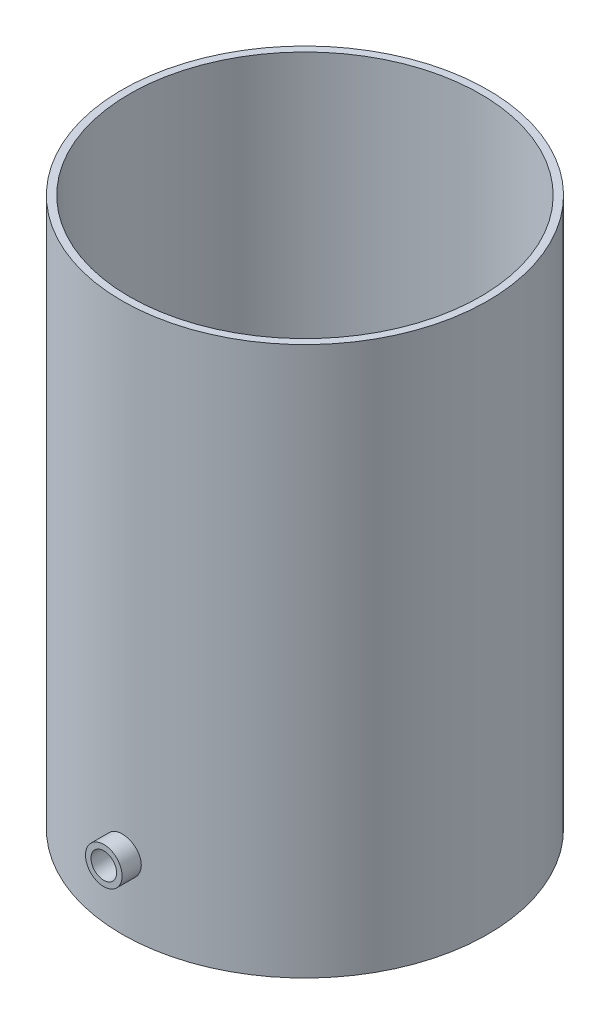
ISO-10303-21;
HEADER;
FILE_DESCRIPTION(('STEP AP214'),'2;1');
FILE_NAME('part.step','',(''),(''),'','','');
FILE_SCHEMA(('AUTOMOTIVE_DESIGN { 1 0 10303 214 1 1 1 1 }'));
ENDSEC;
DATA;
#1=APPLICATION_CONTEXT('core data for automotive mechanical design processes');
#2=APPLICATION_PROTOCOL_DEFINITION('international standard','automotive_design',2000,#1);
#3=PRODUCT_CONTEXT('',#1,'mechanical');
#4=PRODUCT('Part','Part','',(#3));
#5=PRODUCT_RELATED_PRODUCT_CATEGORY('part','',(#4));
#6=PRODUCT_DEFINITION_FORMATION('','',#4);
#7=PRODUCT_DEFINITION_CONTEXT('part definition',#1,'design');
#8=PRODUCT_DEFINITION('design','',#6,#7);
#9=PRODUCT_DEFINITION_SHAPE('','',#8);
#10=(LENGTH_UNIT() NAMED_UNIT(*) SI_UNIT(.MILLI.,.METRE.));
#11=(NAMED_UNIT(*) PLANE_ANGLE_UNIT() SI_UNIT($,.RADIAN.));
#12=(NAMED_UNIT(*) SI_UNIT($,.STERADIAN.) SOLID_ANGLE_UNIT());
#13=UNCERTAINTY_MEASURE_WITH_UNIT(LENGTH_MEASURE(1.E-05),#10,'distance_accuracy_value','');
#14=(GEOMETRIC_REPRESENTATION_CONTEXT(3) GLOBAL_UNCERTAINTY_ASSIGNED_CONTEXT((#13)) GLOBAL_UNIT_ASSIGNED_CONTEXT((#10,
#11,#12)) REPRESENTATION_CONTEXT('',''));
#15=CARTESIAN_POINT('',(0.,0.,0.));
#16=DIRECTION('',(0.,0.,1.));
#17=DIRECTION('',(1.,0.,0.));
#18=AXIS2_PLACEMENT_3D('',#15,#16,#17);
#19=CARTESIAN_POINT('',(0.,150.,0.));
#20=DIRECTION('',(0.,-1.,0.));
#21=DIRECTION('',(0.,0.,-1.));
#22=AXIS2_PLACEMENT_3D('',#19,#20,#21);
#23=CYLINDRICAL_SURFACE('',#22,50.);
#24=CARTESIAN_POINT('',(5.,18.7905589372738,49.749371855331));
#25=CARTESIAN_POINT('',(5.00000137801268,18.9306574283152,49.7493714739879));
#26=CARTESIAN_POINT('',(4.99410950132877,19.0707348898251,49.7499648645192));
#27=CARTESIAN_POINT('',(4.97058574667104,19.34993561116,49.7523207806819));
#28=CARTESIAN_POINT('',(4.95295105278473,19.4890586340254,49.7540835867374));
#29=CARTESIAN_POINT('',(4.90604778501381,19.7654217035784,49.758730371628));
#30=CARTESIAN_POINT('',(4.87676993272645,19.9026601580055,49.7616152445949));
#31=CARTESIAN_POINT('',(4.80678208564671,20.1742181837188,49.7684245439498));
#32=CARTESIAN_POINT('',(4.76606790661486,20.3085366672521,49.7723493507912));
#33=CARTESIAN_POINT('',(4.67355297319563,20.5731202031947,49.7811214960436));
#34=CARTESIAN_POINT('',(4.62176310368343,20.7033890924935,49.7859679281928));
#35=CARTESIAN_POINT('',(4.50742487178653,20.9591411492593,49.7964498317184));
#36=CARTESIAN_POINT('',(4.44487254796571,21.084622533693,49.802085593488));
#37=CARTESIAN_POINT('',(4.30950824036611,21.3297982507876,49.8139814691518));
#38=CARTESIAN_POINT('',(4.23670214819133,21.4494958540135,49.820241223913));
#39=CARTESIAN_POINT('',(4.08129001384987,21.6823883095224,49.833213339352));
#40=CARTESIAN_POINT('',(3.99868035100199,21.7955807362445,49.8399258668515));
#41=CARTESIAN_POINT('',(3.82401365076816,22.0149398958204,49.8536318919189));
#42=CARTESIAN_POINT('',(3.73193021365889,22.1210855614819,49.8606261396673));
#43=CARTESIAN_POINT('',(3.53912598644838,22.3252884435846,49.8746822607949));
#44=CARTESIAN_POINT('',(3.43840201622495,22.4233426557153,49.8817441582155));
#45=CARTESIAN_POINT('',(3.22908697054911,22.6105995568521,49.8957312091272));
#46=CARTESIAN_POINT('',(3.12049844179171,22.6998050892544,49.9026564059683));
#47=CARTESIAN_POINT('',(2.89614565742539,22.868802615413,49.9161794607368));
#48=CARTESIAN_POINT('',(2.780378768861,22.948591123564,49.9227771969379));
#49=CARTESIAN_POINT('',(2.54231086820845,23.0982798233615,49.9354672050881));
#50=CARTESIAN_POINT('',(2.41999887482734,23.1681626300796,49.9415585807929));
#51=CARTESIAN_POINT('',(2.16984658788752,23.2973977499771,49.95305247823));
#52=CARTESIAN_POINT('',(2.04200426340686,23.3567461530346,49.9584547439725));
#53=CARTESIAN_POINT('',(1.78177823539071,23.4644305640457,49.9684119508101));
#54=CARTESIAN_POINT('',(1.64939631724147,23.512770845528,49.9729672205962));
#55=CARTESIAN_POINT('',(1.38098814479936,23.5981303443976,49.9811060833905));
#56=CARTESIAN_POINT('',(1.2449605686204,23.6351453932555,49.9846893185627));
#57=CARTESIAN_POINT('',(0.833882388769763,23.7284955790674,49.9937912974821));
#58=CARTESIAN_POINT('',(0.554665092858854,23.7676189270357,49.9977085084183));
#59=CARTESIAN_POINT('',(-0.00624616004479828,23.7984494565628,50.0007876636083));
#60=CARTESIAN_POINT('',(-0.287940052633875,23.7901578675224,49.9999497311561));
#61=CARTESIAN_POINT('',(-0.844932903547254,23.726582796055,49.9936330634674));
#62=CARTESIAN_POINT('',(-1.12025111715595,23.6714673470847,49.9881709230417));
#63=CARTESIAN_POINT('',(-1.657698930081,23.5160543049235,49.9732365977921));
#64=CARTESIAN_POINT('',(-1.91982835803123,23.4157561248272,49.9637643608788));
#65=CARTESIAN_POINT('',(-2.42400075872671,23.1726448490335,49.9418468380512));
#66=CARTESIAN_POINT('',(-2.66600763658342,23.0297573767378,49.9293963586015));
#67=CARTESIAN_POINT('',(-3.1226677842022,22.7055763934794,49.9029192356571));
#68=CARTESIAN_POINT('',(-3.33732025142287,22.5242817561178,49.8888925459413));
#69=CARTESIAN_POINT('',(-3.73416380023819,22.1274877700501,49.8607646707804));
#70=CARTESIAN_POINT('',(-3.91620871518172,21.9118422082987,49.8466634279516));
#71=CARTESIAN_POINT('',(-4.24153769255961,21.4529746164872,49.8200369971109));
#72=CARTESIAN_POINT('',(-4.38482169876916,21.2097525464268,49.8075118113852));
#73=CARTESIAN_POINT('',(-4.62856091866056,20.7025238098609,49.7854544755204));
#74=CARTESIAN_POINT('',(-4.72900710181732,20.4385127747726,49.7759229565795));
#75=CARTESIAN_POINT('',(-4.88410367923539,19.8972559145872,49.7609450935951));
#76=CARTESIAN_POINT('',(-4.93875546869956,19.62001049297,49.7554986250941));
#77=CARTESIAN_POINT('',(-5.00052387697534,19.0614380394935,49.7493290263652));
#78=CARTESIAN_POINT('',(-5.00784498433649,18.780133835803,49.7485855774055));
#79=CARTESIAN_POINT('',(-4.97528123325639,18.2203026083062,49.7518525677133));
#80=CARTESIAN_POINT('',(-4.93539701266267,17.9417755470258,49.7558629427463));
#81=CARTESIAN_POINT('',(-4.80972587691448,17.3960010254293,49.7681672212266));
#82=CARTESIAN_POINT('',(-4.72403565233786,17.1287310801372,49.7764521004679));
#83=CARTESIAN_POINT('',(-4.50928358198601,16.6123586802857,49.7963645515391));
#84=CARTESIAN_POINT('',(-4.3802207427195,16.3632566420388,49.8079921999376));
#85=CARTESIAN_POINT('',(-4.081875068523,15.8893590609079,49.8333292192867));
#86=CARTESIAN_POINT('',(-3.91245672874386,15.6646492041868,49.8470455463444));
#87=CARTESIAN_POINT('',(-3.53840243770979,15.2467836941598,49.8749916256484));
#88=CARTESIAN_POINT('',(-3.33376561445492,15.0536288223776,49.8892213906003));
#89=CARTESIAN_POINT('',(-2.89419988100485,14.7036506831665,49.9166524134836));
#90=CARTESIAN_POINT('',(-2.65916449432984,14.5469608136719,49.9298497813476));
#91=CARTESIAN_POINT('',(-2.16598537264713,14.2752799204082,49.9536720267587));
#92=CARTESIAN_POINT('',(-1.90784195433101,14.1602883252806,49.9642969395534));
#93=CARTESIAN_POINT('',(-1.37629260849047,13.9754888856322,49.9817608134462));
#94=CARTESIAN_POINT('',(-1.10291484771759,13.9056004760355,49.9886065219256));
#95=CARTESIAN_POINT('',(-0.548079411705791,13.8127481138597,49.99776363907));
#96=CARTESIAN_POINT('',(-0.266621963774155,13.7897828424929,50.0000751751691));
#97=CARTESIAN_POINT('',(0.154560631877543,13.790977101136,49.9999593967711));
#98=CARTESIAN_POINT('',(0.294557002326109,13.7972758755691,49.9993276094659));
#99=CARTESIAN_POINT('',(0.573504458936776,13.8215897774373,49.9969046663024));
#100=CARTESIAN_POINT('',(0.712455913740135,13.8396005558685,49.9951139407924));
#101=CARTESIAN_POINT('',(0.988379892074268,13.8872209169918,49.9904208009026));
#102=CARTESIAN_POINT('',(1.1253516718031,13.9168347474433,49.9875179794045));
#103=CARTESIAN_POINT('',(1.39625643078088,13.9874296828221,49.9806844280751));
#104=CARTESIAN_POINT('',(1.53019050208045,14.0284066303445,49.9767540742154));
#105=CARTESIAN_POINT('',(1.79415256649365,14.1214471102744,49.967974366883));
#106=CARTESIAN_POINT('',(1.92417967668243,14.17351312749,49.963124807464));
#107=CARTESIAN_POINT('',(2.17933687671623,14.2883310973234,49.952645478799));
#108=CARTESIAN_POINT('',(2.30446873549389,14.3510791452218,49.9470159947868));
#109=CARTESIAN_POINT('',(2.5490538144201,14.4868517325829,49.9351311532279));
#110=CARTESIAN_POINT('',(2.6685050084729,14.5598799023736,49.9288755748083));
#111=CARTESIAN_POINT('',(2.90080624471961,14.7156511676476,49.9159178406001));
#112=CARTESIAN_POINT('',(3.01365866446037,14.7983907313851,49.9092158475405));
#113=CARTESIAN_POINT('',(3.23252356376648,14.9734244868848,49.89551955036));
#114=CARTESIAN_POINT('',(3.33850247977287,15.0657605572917,49.8885240518713));
#115=CARTESIAN_POINT('',(3.54227369236162,15.2589863736297,49.8744696846306));
#116=CARTESIAN_POINT('',(3.64006896222842,15.3598729859253,49.8674108399346));
#117=CARTESIAN_POINT('',(3.82688647618723,15.5695852094264,49.8534223720552));
#118=CARTESIAN_POINT('',(3.91590334417577,15.6784156154813,49.84649283014));
#119=CARTESIAN_POINT('',(4.0844367545897,15.9031557506482,49.8329662289084));
#120=CARTESIAN_POINT('',(4.16395679237156,16.0190628512624,49.826369047785));
#121=CARTESIAN_POINT('',(4.31318841414872,16.2575277763916,49.8136731501774));
#122=CARTESIAN_POINT('',(4.38287067354808,16.3801040361758,49.807575945768));
#123=CARTESIAN_POINT('',(4.51162543706042,16.6306813624518,49.7960782991411));
#124=CARTESIAN_POINT('',(4.57070182657144,16.7586804210058,49.7906776019673));
#125=CARTESIAN_POINT('',(4.67780484539498,17.0191330539231,49.7807295606041));
#126=CARTESIAN_POINT('',(4.72584052841938,17.1515828756189,49.7761815177806));
#127=CARTESIAN_POINT('',(4.81056224313698,17.4200463086722,49.7680650371174));
#128=CARTESIAN_POINT('',(4.84725106324241,17.5560590355448,49.7644963586299));
#129=CARTESIAN_POINT('',(4.91858203515326,17.8732247369487,49.7575042744209));
#130=CARTESIAN_POINT('',(4.94908441090261,18.055332692019,49.7544669050514));
#131=CARTESIAN_POINT('',(4.98979244409666,18.4218255541162,49.7504009506177));
#132=CARTESIAN_POINT('',(4.99999818674314,18.6062104515817,49.749372357121));
#133=CARTESIAN_POINT('',(5.,18.7905589372738,49.749371855331));
#134=B_SPLINE_CURVE_WITH_KNOTS('',3,(#24,#25,#26,#27,#28,#29,#30,#31,#32,#33,#34,#35,#36,#37,
#38,#39,#40,#41,#42,#43,#44,#45,#46,#47,#48,#49,#50,#51,#52,#53,#54,#55,#56,#57,#58,#59,#60,#61,
#62,#63,#64,#65,#66,#67,#68,#69,#70,#71,#72,#73,#74,#75,#76,#77,#78,#79,#80,#81,#82,#83,#84,#85,
#86,#87,#88,#89,#90,#91,#92,#93,#94,#95,#96,#97,#98,#99,#100,#101,#102,#103,#104,#105,#106,#107,
#108,#109,#110,#111,#112,#113,#114,#115,#116,#117,#118,#119,#120,#121,#122,#123,#124,#125,#126,
#127,#128,#129,#130,#131,#132,#133),.UNSPECIFIED.,.T.,.F.,(4,2,2,2,2,2,2,2,2,2,2,2,2,2,2,2,2,2,
2,2,2,2,2,2,2,2,2,2,2,2,2,2,2,2,2,2,2,2,2,2,2,2,2,2,2,2,2,2,2,2,2,2,2,2,4),(0.,
0.420134252377986,0.840369288708549,1.26093988247998,1.68166455241807,2.10197763072134,
2.52244574981761,2.9426732548295,3.36305644524304,3.78464455225725,4.20638849474177,
4.62799647384532,5.04976002021869,5.47225484994391,5.8949061733306,6.31739313593607,
6.74003541866831,7.58156484320105,8.42307244819019,9.26157288921165,10.1000842223273,
10.9400685715992,11.780077559205,12.6237625525286,13.4674487696567,14.3113127541753,
15.1551510280302,15.9953411136668,16.8355198466221,17.6739320335049,18.5123634263309,
19.3536507888645,20.1949589844387,21.0392981391845,21.8836257241788,22.7264409329966,
23.569232453936,23.9892420866313,24.4090958466629,24.8291034547195,25.2489575975693,
25.6689059193386,26.0887010611433,26.5086448232866,26.9284363348062,27.3501435264971,
27.7716968321212,28.1935067243476,28.6151608857008,29.0380465190118,29.4607769131124,
29.8831594088447,30.3054380244043,30.8582736600066,31.411106974895),.UNSPECIFIED.);
#135=CARTESIAN_POINT('',(5.,18.7905589372738,49.749371855331));
#136=VERTEX_POINT('',#135);
#137=EDGE_CURVE('E65',#136,#136,#134,.T.);
#138=ORIENTED_EDGE('',*,*,#137,.F.);
#139=EDGE_LOOP('',(#138));
#140=FACE_BOUND('',#139,.T.);
#141=CARTESIAN_POINT('',(0.,150.,0.));
#142=DIRECTION('',(0.,1.,0.));
#143=DIRECTION('',(0.,0.,1.));
#144=AXIS2_PLACEMENT_3D('',#141,#142,#143);
#145=CIRCLE('',#144,50.);
#146=CARTESIAN_POINT('',(0.,150.,50.));
#147=VERTEX_POINT('',#146);
#148=EDGE_CURVE('E51',#147,#147,#145,.T.);
#149=ORIENTED_EDGE('',*,*,#148,.F.);
#150=EDGE_LOOP('',(#149));
#151=FACE_BOUND('',#150,.T.);
#152=CARTESIAN_POINT('',(0.,0.,0.));
#153=DIRECTION('',(0.,1.,0.));
#154=DIRECTION('',(0.,0.,1.));
#155=AXIS2_PLACEMENT_3D('',#152,#153,#154);
#156=CIRCLE('',#155,50.);
#157=CARTESIAN_POINT('',(0.,0.,50.));
#158=VERTEX_POINT('',#157);
#159=EDGE_CURVE('E55',#158,#158,#156,.T.);
#160=ORIENTED_EDGE('',*,*,#159,.T.);
#161=EDGE_LOOP('',(#160));
#162=FACE_BOUND('',#161,.T.);
#163=CARTESIAN_POINT('',(0.,23.7905589372738,-50.));
#164=CARTESIAN_POINT('',(0.140100461033939,23.7905603150286,-50.0000003743881));
#165=CARTESIAN_POINT('',(0.280179892133935,23.7846682742154,-49.9994099664565));
#166=CARTESIAN_POINT('',(0.559384605481638,23.761143848146,-49.9970656286844));
#167=CARTESIAN_POINT('',(0.698509650807411,23.7435086471826,-49.9953114197949));
#168=CARTESIAN_POINT('',(0.974876810291471,23.6966039919592,-49.990686488879));
#169=CARTESIAN_POINT('',(1.11211733275273,23.667325261914,-49.9878148767159));
#170=CARTESIAN_POINT('',(1.38367953746195,23.5973352487088,-49.9810352616414));
#171=CARTESIAN_POINT('',(1.51800013207783,23.556619781557,-49.9771268794695));
#172=CARTESIAN_POINT('',(1.78258815793808,23.4641017370919,-49.968388862618));
#173=CARTESIAN_POINT('',(1.9128594168042,23.4123100186544,-49.9635601307267));
#174=CARTESIAN_POINT('',(2.16861600653063,23.2979676404163,-49.9531129442553));
#175=CARTESIAN_POINT('',(2.29409955432331,23.2354130191065,-49.9474941990341));
#176=CARTESIAN_POINT('',(2.53927920710544,23.1000437656533,-49.9356297496778));
#177=CARTESIAN_POINT('',(2.65897858413043,23.027235027599,-49.9293844063018));
#178=CARTESIAN_POINT('',(2.89187409366608,22.8718173593229,-49.9164369111371));
#179=CARTESIAN_POINT('',(3.00506780046608,22.7892048083796,-49.90973459097));
#180=CARTESIAN_POINT('',(3.22442516584175,22.6145352313753,-49.8960438865044));
#181=CARTESIAN_POINT('',(3.33056800916345,22.5224521230995,-49.8890547458808));
#182=CARTESIAN_POINT('',(3.53476522468386,22.3296491506162,-49.8750029081307));
#183=CARTESIAN_POINT('',(3.6328165925971,22.2289261065415,-49.8679401847701));
#184=CARTESIAN_POINT('',(3.82006793418719,22.0196134760238,-49.853945639318));
#185=CARTESIAN_POINT('',(3.90927074723064,21.9110264324949,-49.8470137758174));
#186=CARTESIAN_POINT('',(4.07826305039189,21.6866771710813,-49.8334722976176));
#187=CARTESIAN_POINT('',(4.15804905479459,21.5709123203028,-49.8268628027738));
#188=CARTESIAN_POINT('',(4.30773494085765,21.3328460075943,-49.8141453282559));
#189=CARTESIAN_POINT('',(4.37761719102718,21.2105334090037,-49.8080382509359));
#190=CARTESIAN_POINT('',(4.50685113325593,20.960379951196,-49.796510955401));
#191=CARTESIAN_POINT('',(4.56619891513861,20.8325370610557,-49.7910909924413));
#192=CARTESIAN_POINT('',(4.67388203969832,20.5723098781158,-49.7810984182545));
#193=CARTESIAN_POINT('',(4.72222165895323,20.4399273719948,-49.7765254780955));
#194=CARTESIAN_POINT('',(4.80757979958036,20.1715179084228,-49.7683532658288));
#195=CARTESIAN_POINT('',(4.84459415265808,20.0354896291207,-49.7647543522704));
#196=CARTESIAN_POINT('',(4.93794230581998,19.6244084103272,-49.7556112743006));
#197=CARTESIAN_POINT('',(4.97706409180383,19.3451885112565,-49.7516744142284));
#198=CARTESIAN_POINT('',(5.00789059851941,18.7842721631673,-49.7485802587524));
#199=CARTESIAN_POINT('',(4.9995965655709,18.5025757794373,-49.7494228377215));
#200=CARTESIAN_POINT('',(4.93601762379309,17.9455937048532,-49.7557708498252));
#201=CARTESIAN_POINT('',(4.88090320838524,17.6702884729576,-49.7612593648233));
#202=CARTESIAN_POINT('',(4.72549673300413,17.1328660889001,-49.7762565790783));
#203=CARTESIAN_POINT('',(4.62520406273851,16.8707491149455,-49.7857653326426));
#204=CARTESIAN_POINT('',(4.38210419746261,16.3665918154359,-49.8077505089504));
#205=CARTESIAN_POINT('',(4.23922134072076,16.1245882081484,-49.8202322051485));
#206=CARTESIAN_POINT('',(3.91505020964741,15.6679326443869,-49.846752576903));
#207=CARTESIAN_POINT('',(3.73376081125102,15.4532814887464,-49.8607912980239));
#208=CARTESIAN_POINT('',(3.33697054240559,15.0564320262057,-49.8889192682764));
#209=CARTESIAN_POINT('',(3.12132238898974,14.8743809436402,-49.9030084673536));
#210=CARTESIAN_POINT('',(2.66244741395265,14.5490407569514,-49.9295914532222));
#211=CARTESIAN_POINT('',(2.41922056141157,14.4057516962867,-49.9420852382248));
#212=CARTESIAN_POINT('',(1.91199052704802,14.1620088399281,-49.9640737835429));
#213=CARTESIAN_POINT('',(1.64798373156272,14.061562514231,-49.9735680207869));
#214=CARTESIAN_POINT('',(1.10673608703645,13.9064643526677,-49.988482372022));
#215=CARTESIAN_POINT('',(0.829495634016399,13.8518111473363,-49.9939026078476));
#216=CARTESIAN_POINT('',(0.270925495326698,13.7900373985845,-50.0000425834211));
#217=CARTESIAN_POINT('',(-0.0103815106741372,13.7827136949108,-50.000782413361));
#218=CARTESIAN_POINT('',(-0.570218966431819,13.8152732536181,-49.9975320878656));
#219=CARTESIAN_POINT('',(-0.848749453648461,13.8551558782366,-49.993541996332));
#220=CARTESIAN_POINT('',(-1.39454103462632,13.9808274100044,-49.9812930768513));
#221=CARTESIAN_POINT('',(-1.66182424652395,14.0665211932687,-49.9730430954945));
#222=CARTESIAN_POINT('',(-2.17822160525502,14.2812848238558,-49.953199943438));
#223=CARTESIAN_POINT('',(-2.42733534458293,14.4103556436763,-49.9416066977843));
#224=CARTESIAN_POINT('',(-2.90124090708419,14.7087130691826,-49.9163237649944));
#225=CARTESIAN_POINT('',(-3.12594832200516,14.8781331523532,-49.9026271744651));
#226=CARTESIAN_POINT('',(-3.54380809329823,15.2521895055339,-49.8746966491831));
#227=CARTESIAN_POINT('',(-3.73695965742386,15.4568266594448,-49.8604627009505));
#228=CARTESIAN_POINT('',(-4.08693063657039,15.8963909506641,-49.8330011856591));
#229=CARTESIAN_POINT('',(-4.24361671913491,16.1314245053869,-49.8197774270285));
#230=CARTESIAN_POINT('',(-4.51529096798641,16.6245989525634,-49.7958917029636));
#231=CARTESIAN_POINT('',(-4.63027970447968,16.8827395289711,-49.7852297024982));
#232=CARTESIAN_POINT('',(-4.81507725706781,17.414290657509,-49.7676970839323));
#233=CARTESIAN_POINT('',(-4.88496539977527,17.6876734748294,-49.7608198120965));
#234=CARTESIAN_POINT('',(-4.97781551006116,18.2425195886968,-49.7516193745049));
#235=CARTESIAN_POINT('',(-5.0007788234884,18.5239826532598,-49.7492960781367));
#236=CARTESIAN_POINT('',(-4.99958027457784,18.9451662222175,-49.7494127947303));
#237=CARTESIAN_POINT('',(-4.99328044671944,19.0851581884164,-49.7500479099195));
#238=CARTESIAN_POINT('',(-4.96896519008512,19.3640967133967,-49.7524830219634));
#239=CARTESIAN_POINT('',(-4.9509541101499,19.503043640875,-49.754282586412));
#240=CARTESIAN_POINT('',(-4.9033339265936,19.7789585035611,-49.7589979715237));
#241=CARTESIAN_POINT('',(-4.87372057237539,19.915925694384,-49.7619142012784));
#242=CARTESIAN_POINT('',(-4.8031274021827,20.1868212731159,-49.7687776142575));
#243=CARTESIAN_POINT('',(-4.7621517427028,20.3207507529188,-49.7727244204516));
#244=CARTESIAN_POINT('',(-4.66911475363506,20.5847034879644,-49.7815382320036));
#245=CARTESIAN_POINT('',(-4.6170509625864,20.7147258685427,-49.7864054416556));
#246=CARTESIAN_POINT('',(-4.50223825911722,20.9698739535313,-49.7969192874116));
#247=CARTESIAN_POINT('',(-4.43949325070048,21.095001426562,-49.8025656385956));
#248=CARTESIAN_POINT('',(-4.30372744333054,21.3395782947513,-49.8144815572328));
#249=CARTESIAN_POINT('',(-4.23070301224569,21.4590256628571,-49.82075134474));
#250=CARTESIAN_POINT('',(-4.07493978433922,21.6913199622855,-49.8337332394463));
#251=CARTESIAN_POINT('',(-3.99220451871276,21.8041692706648,-49.8404451854741));
#252=CARTESIAN_POINT('',(-3.81717528907235,22.0230343727823,-49.8541564093712));
#253=CARTESIAN_POINT('',(-3.72483897640454,22.1290162287108,-49.8611568702573));
#254=CARTESIAN_POINT('',(-3.53161206753512,22.3327933443092,-49.8752152226331));
#255=CARTESIAN_POINT('',(-3.43072460522393,22.4305915772859,-49.8822730922333));
#256=CARTESIAN_POINT('',(-3.2210100998708,22.6174149009678,-49.8962537831342));
#257=CARTESIAN_POINT('',(-3.11217826461907,22.7064346189029,-49.9031765196754));
#258=CARTESIAN_POINT('',(-2.88743471180054,22.8749735088648,-49.9166844506629));
#259=CARTESIAN_POINT('',(-2.77152562327502,22.9544961767727,-49.9232697688008));
#260=CARTESIAN_POINT('',(-2.5330592655813,23.1037308347114,-49.9359380152465));
#261=CARTESIAN_POINT('',(-2.41048371893775,23.1734137521737,-49.9420194337243));
#262=CARTESIAN_POINT('',(-2.15990777377624,23.3021699076479,-49.9534835762051));
#263=CARTESIAN_POINT('',(-2.03190938317773,23.3612470309634,-49.9588665558713));
#264=CARTESIAN_POINT('',(-1.77145809043289,23.4683515771038,-49.9687792484329));
#265=CARTESIAN_POINT('',(-1.63900893926476,23.5163880496343,-49.9733096595983));
#266=CARTESIAN_POINT('',(-1.37054695395703,23.601111388363,-49.9813929477421));
#267=CARTESIAN_POINT('',(-1.23453500404774,23.6378010422498,-49.9849460647987));
#268=CARTESIAN_POINT('',(-0.917364218647636,23.7091356127423,-49.9919068178199));
#269=CARTESIAN_POINT('',(-0.735250267899013,23.7396400062006,-49.9949297207431));
#270=CARTESIAN_POINT('',(-0.368745400564772,23.7803507201355,-49.9989760613865));
#271=CARTESIAN_POINT('',(-0.184354493372666,23.7905571243227,-49.9999995073526));
#272=CARTESIAN_POINT('',(0.,23.7905589372738,-50.));
#273=B_SPLINE_CURVE_WITH_KNOTS('',3,(#163,#164,#165,#166,#167,#168,#169,#170,#171,#172,#173,
#174,#175,#176,#177,#178,#179,#180,#181,#182,#183,#184,#185,#186,#187,#188,#189,#190,#191,#192,
#193,#194,#195,#196,#197,#198,#199,#200,#201,#202,#203,#204,#205,#206,#207,#208,#209,#210,#211,
#212,#213,#214,#215,#216,#217,#218,#219,#220,#221,#222,#223,#224,#225,#226,#227,#228,#229,#230,
#231,#232,#233,#234,#235,#236,#237,#238,#239,#240,#241,#242,#243,#244,#245,#246,#247,#248,#249,
#250,#251,#252,#253,#254,#255,#256,#257,#258,#259,#260,#261,#262,#263,#264,#265,#266,#267,#268,
#269,#270,#271,#272),.UNSPECIFIED.,.T.,.F.,(4,2,2,2,2,2,2,2,2,2,2,2,2,2,2,2,2,2,2,2,2,2,2,2,2,2,
2,2,2,2,2,2,2,2,2,2,2,2,2,2,2,2,2,2,2,2,2,2,2,2,2,2,2,2,4),(0.,0.420140168309291,
0.840381111696771,1.26095751168313,1.68168797529278,2.10200784094379,2.52248274628059,
2.94271694071896,3.36310682092266,3.78468715311913,4.20642331622124,4.62802370983913,
5.04977967635892,5.47227730157367,5.89493142271309,6.31742106512359,6.74006601944364,
7.58160289957827,8.42311766010726,9.26158116937397,10.1000560054001,10.9400293659632,
11.7800273138747,12.6237280071288,13.467429646307,14.3112783319975,15.1551017810904,
15.9953007277063,16.8354883232756,17.6739380620337,18.5124065997918,19.3536883347534,
20.1949911878299,21.0393234777484,21.8836442210872,22.7264758269686,23.5692832592977,
23.9892798829599,24.4091206346367,24.8291153427782,25.2489566130453,25.6688911814504,
26.0886725912905,26.5086027007735,26.9283805794993,27.3500956078529,27.7716567456625,
28.1934743134009,28.6151361275947,29.0380188241247,29.460746285189,29.883126003011,
30.305401867917,30.8582554897697,31.4111068316036),.UNSPECIFIED.);
#274=CARTESIAN_POINT('',(0.,23.7905589372738,-50.));
#275=VERTEX_POINT('',#274);
#276=EDGE_CURVE('E10',#275,#275,#273,.T.);
#277=ORIENTED_EDGE('',*,*,#276,.F.);
#278=EDGE_LOOP('',(#277));
#279=FACE_BOUND('',#278,.T.);
#280=ADVANCED_FACE('F40',(#140,#151,#162,#279),#23,.T.);
#281=CARTESIAN_POINT('',(0.,150.,0.));
#282=DIRECTION('',(0.,1.,0.));
#283=DIRECTION('',(0.,0.,1.));
#284=AXIS2_PLACEMENT_3D('',#281,#282,#283);
#285=PLANE('',#284);
#286=ORIENTED_EDGE('',*,*,#148,.T.);
#287=EDGE_LOOP('',(#286));
#288=FACE_BOUND('',#287,.T.);
#289=CARTESIAN_POINT('',(0.,150.,0.));
#290=DIRECTION('',(0.,1.,0.));
#291=DIRECTION('',(0.,0.,1.));
#292=AXIS2_PLACEMENT_3D('',#289,#290,#291);
#293=CIRCLE('',#292,48.);
#294=CARTESIAN_POINT('',(0.,150.,48.));
#295=VERTEX_POINT('',#294);
#296=EDGE_CURVE('E60',#295,#295,#293,.T.);
#297=ORIENTED_EDGE('',*,*,#296,.F.);
#298=EDGE_LOOP('',(#297));
#299=FACE_BOUND('',#298,.T.);
#300=ADVANCED_FACE('F99',(#288,#299),#285,.T.);
#301=CARTESIAN_POINT('',(0.,0.,0.));
#302=DIRECTION('',(0.,1.,0.));
#303=DIRECTION('',(0.,0.,1.));
#304=AXIS2_PLACEMENT_3D('',#301,#302,#303);
#305=PLANE('',#304);
#306=ORIENTED_EDGE('',*,*,#159,.F.);
#307=EDGE_LOOP('',(#306));
#308=FACE_BOUND('',#307,.T.);
#309=CARTESIAN_POINT('',(0.,0.,0.));
#310=DIRECTION('',(0.,1.,0.));
#311=DIRECTION('',(0.,0.,1.));
#312=AXIS2_PLACEMENT_3D('',#309,#310,#311);
#313=CIRCLE('',#312,48.);
#314=CARTESIAN_POINT('',(0.,0.,48.));
#315=VERTEX_POINT('',#314);
#316=EDGE_CURVE('E62',#315,#315,#313,.T.);
#317=ORIENTED_EDGE('',*,*,#316,.T.);
#318=EDGE_LOOP('',(#317));
#319=FACE_BOUND('',#318,.T.);
#320=ADVANCED_FACE('F94',(#308,#319),#305,.F.);
#321=CARTESIAN_POINT('',(0.,150.,0.));
#322=DIRECTION('',(0.,-1.,0.));
#323=DIRECTION('',(0.,0.,-1.));
#324=AXIS2_PLACEMENT_3D('',#321,#322,#323);
#325=CYLINDRICAL_SURFACE('',#324,48.);
#326=CARTESIAN_POINT('',(0.,22.2905589372738,-48.));
#327=CARTESIAN_POINT('',(-0.196316737087011,22.290550327557,-47.999998314885));
#328=CARTESIAN_POINT('',(-0.392769163715083,22.2739861529966,-47.9987827555955));
#329=CARTESIAN_POINT('',(-0.780244437071165,22.2081489825878,-47.9940505151423));
#330=CARTESIAN_POINT('',(-0.971260778787283,22.1588383869092,-47.9905311888323));
#331=CARTESIAN_POINT('',(-1.34219554689538,22.0289367254721,-47.9815893453795));
#332=CARTESIAN_POINT('',(-1.52211996353107,21.9483627182354,-47.9761678662787));
#333=CARTESIAN_POINT('',(-1.86584511255985,21.7582504539965,-47.9640306566817));
#334=CARTESIAN_POINT('',(-2.02964941308498,21.648718626585,-47.9573152135779));
#335=CARTESIAN_POINT('',(-2.33685508474223,21.4035635282267,-47.9433294072533));
#336=CARTESIAN_POINT('',(-2.48022009852654,21.2678947481743,-47.9360580896743));
#337=CARTESIAN_POINT('',(-2.74216609151634,20.9744120822291,-47.9217881334207));
#338=CARTESIAN_POINT('',(-2.86074601091128,20.8165972498533,-47.9147895064168));
#339=CARTESIAN_POINT('',(-3.06987409202356,20.4830882574769,-47.9018465506979));
#340=CARTESIAN_POINT('',(-3.16039105971814,20.3073744875795,-47.8959033983313));
#341=CARTESIAN_POINT('',(-3.3106244027704,19.9431925594134,-47.8857543390969));
#342=CARTESIAN_POINT('',(-3.37034120781006,19.7547245791155,-47.8815484079939));
#343=CARTESIAN_POINT('',(-3.45717557739047,19.3707425670913,-47.8753574238119));
#344=CARTESIAN_POINT('',(-3.484351420791,19.1752417796961,-47.8733684008305));
#345=CARTESIAN_POINT('',(-3.50551241756807,18.7824441779782,-47.8718236643034));
#346=CARTESIAN_POINT('',(-3.4994980613978,18.5851473902381,-47.8722679148013));
#347=CARTESIAN_POINT('',(-3.45449764244278,18.1947564747816,-47.8755359440817));
#348=CARTESIAN_POINT('',(-3.41557476801679,18.0016550198407,-47.8783551625992));
#349=CARTESIAN_POINT('',(-3.30596027591858,17.6247335503884,-47.8860482799574));
#350=CARTESIAN_POINT('',(-3.2352684119987,17.4409136078321,-47.8909221947245));
#351=CARTESIAN_POINT('',(-3.06405134485914,17.0875708728856,-47.902180743519));
#352=CARTESIAN_POINT('',(-2.96349762350364,16.9180619471883,-47.9085668204777));
#353=CARTESIAN_POINT('',(-2.73543180160518,16.5983045933085,-47.9221286974105));
#354=CARTESIAN_POINT('',(-2.60791928506839,16.4480564623917,-47.92930450957));
#355=CARTESIAN_POINT('',(-2.32920028684797,16.1707181612884,-47.9436575298958));
#356=CARTESIAN_POINT('',(-2.17793914721246,16.0436829128126,-47.9508347021589));
#357=CARTESIAN_POINT('',(-1.85620782894145,15.8168005410795,-47.9643656479059));
#358=CARTESIAN_POINT('',(-1.68573764106417,15.716953430903,-47.9707194209936));
#359=CARTESIAN_POINT('',(-1.33039282248398,15.5472857027673,-47.9818884488372));
#360=CARTESIAN_POINT('',(-1.14551711659266,15.4774673286113,-47.9867035886167));
#361=CARTESIAN_POINT('',(-0.766624776904359,15.369876464548,-47.9942513627934));
#362=CARTESIAN_POINT('',(-0.572608288400159,15.3321034654606,-47.9969840302797));
#363=CARTESIAN_POINT('',(-0.181418096466174,15.2897440153639,-48.0000546972346));
#364=CARTESIAN_POINT('',(0.0157473470887529,15.2850816639887,-48.0003981734688));
#365=CARTESIAN_POINT('',(0.40805728363101,15.3088773004592,-47.998666351323));
#366=CARTESIAN_POINT('',(0.603201790985797,15.3373350526807,-47.9965910701507));
#367=CARTESIAN_POINT('',(0.985715399178932,15.4265002103004,-47.9902587695949));
#368=CARTESIAN_POINT('',(1.17309269867893,15.4871726261544,-47.9860041174838));
#369=CARTESIAN_POINT('',(1.53500641812635,15.6390092166739,-47.9757914012687));
#370=CARTESIAN_POINT('',(1.70954268152178,15.7301737630102,-47.9698333164016));
#371=CARTESIAN_POINT('',(2.0411664610272,15.9405988547885,-47.956868811667));
#372=CARTESIAN_POINT('',(2.19822185745092,16.0599099025812,-47.9498605157829));
#373=CARTESIAN_POINT('',(2.49010192498372,16.3231679460449,-47.9355899975049));
#374=CARTESIAN_POINT('',(2.62492629989622,16.4671152699071,-47.9283277717294));
#375=CARTESIAN_POINT('',(2.86877577944745,16.7758880835154,-47.9143518532065));
#376=CARTESIAN_POINT('',(2.97775150865499,16.9407526217474,-47.9076392260445));
#377=CARTESIAN_POINT('',(3.16647216861626,17.286484604406,-47.8955366892029));
#378=CARTESIAN_POINT('',(3.24621733195611,17.4673519214851,-47.8901467689989));
#379=CARTESIAN_POINT('',(3.37412832748217,17.8397775214091,-47.8813052576689));
#380=CARTESIAN_POINT('',(3.42232483998624,18.0313252204765,-47.8778517838647));
#381=CARTESIAN_POINT('',(3.48587046987139,18.4198202823303,-47.8732674661299));
#382=CARTESIAN_POINT('',(3.50122005419262,18.6167675683177,-47.8721365891821));
#383=CARTESIAN_POINT('',(3.49863123709268,19.0099804176457,-47.8723258193994));
#384=CARTESIAN_POINT('',(3.48077043520007,19.2062464993243,-47.873640212939));
#385=CARTESIAN_POINT('',(3.4124291691847,19.5929843478622,-47.8785597579695));
#386=CARTESIAN_POINT('',(3.36194864984299,19.7834561049121,-47.8821649133382));
#387=CARTESIAN_POINT('',(3.22981948039715,20.1532069118743,-47.8912582943493));
#388=CARTESIAN_POINT('',(3.14817169272353,20.3324862713322,-47.8967464678862));
#389=CARTESIAN_POINT('',(2.9560351511478,20.6748042210553,-47.9089874882372));
#390=CARTESIAN_POINT('',(2.8455470070334,20.8378431546002,-47.9157403083113));
#391=CARTESIAN_POINT('',(2.59857598389504,21.1434480182489,-47.9297683227365));
#392=CARTESIAN_POINT('',(2.46203615919196,21.2859678760136,-47.9370446392667));
#393=CARTESIAN_POINT('',(2.16693053645851,21.5461182263946,-47.9512897258089));
#394=CARTESIAN_POINT('',(2.00835938583827,21.6637426529994,-47.9582584205392));
#395=CARTESIAN_POINT('',(1.6734544193649,21.870882359556,-47.9711127183892));
#396=CARTESIAN_POINT('',(1.49709391175383,21.9603545448639,-47.9769966553471));
#397=CARTESIAN_POINT('',(1.13193521794283,22.1083056983078,-47.9869976662948));
#398=CARTESIAN_POINT('',(0.943151761496642,22.1668206532994,-47.9911167907621));
#399=CARTESIAN_POINT('',(0.627693448504029,22.2361294499554,-47.9960548028185));
#400=CARTESIAN_POINT('',(0.503053097053779,22.256513774688,-47.9975276027274));
#401=CARTESIAN_POINT('',(0.252293845247635,22.2837312719091,-47.9995007418906));
#402=CARTESIAN_POINT('',(0.126174947776727,22.2905644708345,-48.0000010830421));
#403=CARTESIAN_POINT('',(0.,22.2905589372738,-48.));
#404=B_SPLINE_CURVE_WITH_KNOTS('',3,(#326,#327,#328,#329,#330,#331,#332,#333,#334,#335,#336,
#337,#338,#339,#340,#341,#342,#343,#344,#345,#346,#347,#348,#349,#350,#351,#352,#353,#354,#355,
#356,#357,#358,#359,#360,#361,#362,#363,#364,#365,#366,#367,#368,#369,#370,#371,#372,#373,#374,
#375,#376,#377,#378,#379,#380,#381,#382,#383,#384,#385,#386,#387,#388,#389,#390,#391,#392,#393,
#394,#395,#396,#397,#398,#399,#400,#401,#402,#403),.UNSPECIFIED.,.T.,.F.,(4,2,2,2,2,2,2,2,2,2,2,
2,2,2,2,2,2,2,2,2,2,2,2,2,2,2,2,2,2,2,2,2,2,2,2,2,2,2,4),(0.,0.588489568935996,1.17765601961282,
1.76650144942666,2.35521624578719,2.94496551868975,3.53474000411282,4.12516773577756,
4.71558723037448,5.30494773086247,5.89429952236519,6.48252224998158,7.07074953710581,
7.65954039895944,8.24834034694793,8.83851585070529,9.42869163840682,10.0189115174841,
10.609122018177,11.1979791265768,11.7868320457328,12.3750466942399,12.9632685128018,
13.5525538954911,14.1418471289316,14.7322571101474,15.322662393399,15.9124926650873,
16.5023145519043,17.0907599899853,17.6792064241948,18.2676365766638,18.8560542886339,
19.4457732561711,20.03563574941,20.6263968431766,21.2164696774042,21.5946991986853,
21.972927982076),.UNSPECIFIED.);
#405=CARTESIAN_POINT('',(0.,22.2905589372738,-48.));
#406=VERTEX_POINT('',#405);
#407=EDGE_CURVE('E124',#406,#406,#404,.T.);
#408=ORIENTED_EDGE('',*,*,#407,.F.);
#409=EDGE_LOOP('',(#408));
#410=FACE_BOUND('',#409,.T.);
#411=CARTESIAN_POINT('',(3.5,18.7905589372738,47.8722257681842));
#412=CARTESIAN_POINT('',(3.49999138957606,18.5942429824981,47.8722274700572));
#413=CARTESIAN_POINT('',(3.48342734256522,18.3977913355925,47.8734463491947));
#414=CARTESIAN_POINT('',(3.41759072487511,18.0103176823594,47.8781904509557));
#415=CARTESIAN_POINT('',(3.36828055169529,17.8193021816549,47.8817183249395));
#416=CARTESIAN_POINT('',(3.23838012631429,17.4483691915135,47.8906787146652));
#417=CARTESIAN_POINT('',(3.1578069527656,17.2684457047101,47.8961101903329));
#418=CARTESIAN_POINT('',(2.96769665152349,16.9247221122654,47.908264478146));
#419=CARTESIAN_POINT('',(2.85816595135998,16.7609184396629,47.9149870036342));
#420=CARTESIAN_POINT('',(2.61301198929144,16.4537120532295,47.9289810477293));
#421=CARTESIAN_POINT('',(2.47734296667445,16.3103458970023,47.9362535153588));
#422=CARTESIAN_POINT('',(2.18385933669576,16.0483977007248,47.9505192591928));
#423=CARTESIAN_POINT('',(2.02604378595915,15.9298167169837,47.9575125234878));
#424=CARTESIAN_POINT('',(1.69253416987266,15.7206875273624,47.9704405346613));
#425=CARTESIAN_POINT('',(1.51682061810998,15.6301703187797,47.9763741080349));
#426=CARTESIAN_POINT('',(1.15263916420776,15.4799364701167,47.9865040505491));
#427=CARTESIAN_POINT('',(0.96417143883987,15.4202194032482,47.9907004437612));
#428=CARTESIAN_POINT('',(0.580190184136626,15.3333844799106,47.9968766033038));
#429=CARTESIAN_POINT('',(0.384689903620491,15.3062083239489,47.9988603333489));
#430=CARTESIAN_POINT('',(-0.00810670735441337,15.2850465264531,48.0004010445214));
#431=CARTESIAN_POINT('',(-0.205403011410987,15.2910603977976,47.9999580612651));
#432=CARTESIAN_POINT('',(-0.595796078166492,15.336060054056,47.9966985477487));
#433=CARTESIAN_POINT('',(-0.788900111111866,15.3749831385101,47.9938865311391));
#434=CARTESIAN_POINT('',(-1.16582662830556,15.4845989461887,47.9862105899786));
#435=CARTESIAN_POINT('',(-1.34964904197534,15.5552919109546,47.9813466498273));
#436=CARTESIAN_POINT('',(-1.70299475338241,15.7265112473497,47.9701065228885));
#437=CARTESIAN_POINT('',(-1.87250431009621,15.8270658785939,47.9637289047836));
#438=CARTESIAN_POINT('',(-2.19226253915424,16.0551336370655,47.9501786919807));
#439=CARTESIAN_POINT('',(-2.34251091385207,16.1826471808129,47.9430060850009));
#440=CARTESIAN_POINT('',(-2.61984803638129,16.4613669015974,47.928652886598));
#441=CARTESIAN_POINT('',(-2.74688207042909,16.6126275284162,47.9214723154425));
#442=CARTESIAN_POINT('',(-2.97376223712844,16.9343573901656,47.907929377064));
#443=CARTESIAN_POINT('',(-3.073608354233,17.1048266360802,47.9015670103089));
#444=CARTESIAN_POINT('',(-3.24327537023096,17.4601712123842,47.8903793109657));
#445=CARTESIAN_POINT('',(-3.31309371640098,17.6450477659913,47.8855541090642));
#446=CARTESIAN_POINT('',(-3.42068426415161,18.0239419463583,47.8779892368627));
#447=CARTESIAN_POINT('',(-3.45845697997787,18.2179594263784,47.875249533096));
#448=CARTESIAN_POINT('',(-3.50081536363125,18.609150058993,47.8721709460296));
#449=CARTESIAN_POINT('',(-3.50547719987232,18.8063149225255,47.8718265525853));
#450=CARTESIAN_POINT('',(-3.48168074021356,19.1986235748108,47.8735630178056));
#451=CARTESIAN_POINT('',(-3.45322267991305,19.3937673779305,47.8756438592182));
#452=CARTESIAN_POINT('',(-3.36405762418638,19.7762775872243,47.8819912896603));
#453=CARTESIAN_POINT('',(-3.30338592487052,19.9636522641561,47.8862554862309));
#454=CARTESIAN_POINT('',(-3.15155164704676,20.3255610560287,47.8964871190597));
#455=CARTESIAN_POINT('',(-3.06038869266555,20.5000950126464,47.9024545763142));
#456=CARTESIAN_POINT('',(-2.84996592607739,20.8317172521021,47.9154336709448));
#457=CARTESIAN_POINT('',(-2.73065520668036,20.9887731582273,47.9224471916458));
#458=CARTESIAN_POINT('',(-2.46739752876744,21.2806544074061,47.9367216331868));
#459=CARTESIAN_POINT('',(-2.32345024448777,21.4154794564599,47.9439825572971));
#460=CARTESIAN_POINT('',(-2.01467713007998,21.6593303476574,47.9579499091259));
#461=CARTESIAN_POINT('',(-1.84981224572437,21.7683068079901,47.9646552598192));
#462=CARTESIAN_POINT('',(-1.50407938014598,21.9570287516604,47.9767404511857));
#463=CARTESIAN_POINT('',(-1.3232115263303,22.0367744676915,47.9821203024107));
#464=CARTESIAN_POINT('',(-0.950786301844838,22.164685838767,47.9909432829903));
#465=CARTESIAN_POINT('',(-0.7592395973767,22.212882413397,47.9943883080903));
#466=CARTESIAN_POINT('',(-0.370746629502869,22.2764285047112,47.9989611028415));
#467=CARTESIAN_POINT('',(-0.173800442025943,22.2917784830521,48.0000889050611));
#468=CARTESIAN_POINT('',(0.219413119681572,22.2891907962255,47.9999002599393));
#469=CARTESIAN_POINT('',(0.415681008834124,22.2713302590315,47.9985894759576));
#470=CARTESIAN_POINT('',(0.802422537285422,22.2029888856759,47.9936822116769));
#471=CARTESIAN_POINT('',(0.992896167347653,22.1525079975177,47.9900857277346));
#472=CARTESIAN_POINT('',(1.36265066046028,22.0203774049377,47.9810109584051));
#473=CARTESIAN_POINT('',(1.54193183046332,21.9387285557329,47.9755327246514));
#474=CARTESIAN_POINT('',(1.88425295693811,21.7465893321318,47.9633085119422));
#475=CARTESIAN_POINT('',(2.04729325780605,21.6360995695022,47.956562559878));
#476=CARTESIAN_POINT('',(2.3528979907044,21.3891267875744,47.9425423227182));
#477=CARTESIAN_POINT('',(2.49541664766557,21.2525871912494,47.9352669093748));
#478=CARTESIAN_POINT('',(2.75556468220909,20.9574825163544,47.9210171574572));
#479=CARTESIAN_POINT('',(2.87318799066585,20.7989120825557,47.9140428926278));
#480=CARTESIAN_POINT('',(3.08032651828131,20.464007678481,47.9011733578568));
#481=CARTESIAN_POINT('',(3.16979843545598,20.2876468882866,47.8952797559253));
#482=CARTESIAN_POINT('',(3.31774900888078,19.9224875908119,47.8852596472072));
#483=CARTESIAN_POINT('',(3.37626365595661,19.7337038149661,47.8811310894626));
#484=CARTESIAN_POINT('',(3.4455715689371,19.4182463284864,47.8761811696019));
#485=CARTESIAN_POINT('',(3.46595549628587,19.293607185453,47.8747046101878));
#486=CARTESIAN_POINT('',(3.49317246546954,19.0428503556781,47.8727263635354));
#487=CARTESIAN_POINT('',(3.50000553398396,18.916732671848,47.8722246743777));
#488=CARTESIAN_POINT('',(3.5,18.7905589372738,47.8722257681842));
#489=B_SPLINE_CURVE_WITH_KNOTS('',3,(#411,#412,#413,#414,#415,#416,#417,#418,#419,#420,#421,
#422,#423,#424,#425,#426,#427,#428,#429,#430,#431,#432,#433,#434,#435,#436,#437,#438,#439,#440,
#441,#442,#443,#444,#445,#446,#447,#448,#449,#450,#451,#452,#453,#454,#455,#456,#457,#458,#459,
#460,#461,#462,#463,#464,#465,#466,#467,#468,#469,#470,#471,#472,#473,#474,#475,#476,#477,#478,
#479,#480,#481,#482,#483,#484,#485,#486,#487,#488),.UNSPECIFIED.,.T.,.F.,(4,2,2,2,2,2,2,2,2,2,2,
2,2,2,2,2,2,2,2,2,2,2,2,2,2,2,2,2,2,2,2,2,2,2,2,2,2,2,4),(0.,0.588487219305095,1.17765137191262,
1.76649412238525,2.35520628050948,2.94495862755919,3.53473610389936,4.12516270563947,
4.71558112579719,5.30494017661248,5.89429057758236,6.48252063917541,7.0707551730666,
7.65954816688848,8.2483502583345,8.83852268344652,9.42869544603904,10.0189183705355,
10.6091318233719,11.1979871055205,11.7868381988561,12.3750454223169,12.9632598970221,
13.5525464660165,14.1418408276175,14.7322520846625,15.322658641591,15.9124857036212,
16.5023044756179,17.0907551653097,17.6792067929902,18.2676422753194,18.8560652769063,
19.4457811166021,20.0356405553142,20.6264029195375,21.2164769475408,21.5947028359257,
21.9729279796421),.UNSPECIFIED.);
#490=CARTESIAN_POINT('',(3.5,18.7905589372738,47.8722257681842));
#491=VERTEX_POINT('',#490);
#492=EDGE_CURVE('E118',#491,#491,#489,.T.);
#493=ORIENTED_EDGE('',*,*,#492,.F.);
#494=EDGE_LOOP('',(#493));
#495=FACE_BOUND('',#494,.T.);
#496=ORIENTED_EDGE('',*,*,#296,.T.);
#497=EDGE_LOOP('',(#496));
#498=FACE_BOUND('',#497,.T.);
#499=ORIENTED_EDGE('',*,*,#316,.F.);
#500=EDGE_LOOP('',(#499));
#501=FACE_BOUND('',#500,.T.);
#502=ADVANCED_FACE('F87',(#410,#495,#498,#501),#325,.F.);
#503=CARTESIAN_POINT('',(0.,18.7905589372738,55.));
#504=DIRECTION('',(0.,0.,1.));
#505=DIRECTION('',(1.,0.,0.));
#506=AXIS2_PLACEMENT_3D('',#503,#504,#505);
#507=PLANE('',#506);
#508=CARTESIAN_POINT('',(0.,18.7905589372738,55.));
#509=DIRECTION('',(0.,0.,1.));
#510=DIRECTION('',(1.,0.,0.));
#511=AXIS2_PLACEMENT_3D('',#508,#509,#510);
#512=CIRCLE('',#511,3.5);
#513=CARTESIAN_POINT('',(3.5,18.7905589372738,55.));
#514=VERTEX_POINT('',#513);
#515=EDGE_CURVE('E151',#514,#514,#512,.T.);
#516=ORIENTED_EDGE('',*,*,#515,.F.);
#517=EDGE_LOOP('',(#516));
#518=FACE_BOUND('',#517,.T.);
#519=CARTESIAN_POINT('',(0.,18.7905589372738,55.));
#520=DIRECTION('',(0.,0.,1.));
#521=DIRECTION('',(1.,0.,0.));
#522=AXIS2_PLACEMENT_3D('',#519,#520,#521);
#523=CIRCLE('',#522,5.);
#524=CARTESIAN_POINT('',(5.,18.7905589372738,55.));
#525=VERTEX_POINT('',#524);
#526=EDGE_CURVE('E75',#525,#525,#523,.T.);
#527=ORIENTED_EDGE('',*,*,#526,.T.);
#528=EDGE_LOOP('',(#527));
#529=FACE_BOUND('',#528,.T.);
#530=ADVANCED_FACE('F85',(#518,#529),#507,.T.);
#531=CARTESIAN_POINT('',(0.,18.7905589372738,-50.001));
#532=DIRECTION('',(0.,0.,1.));
#533=DIRECTION('',(1.,0.,0.));
#534=AXIS2_PLACEMENT_3D('',#531,#532,#533);
#535=CYLINDRICAL_SURFACE('',#534,5.);
#536=ORIENTED_EDGE('',*,*,#526,.F.);
#537=EDGE_LOOP('',(#536));
#538=FACE_BOUND('',#537,.T.);
#539=ORIENTED_EDGE('',*,*,#137,.T.);
#540=EDGE_LOOP('',(#539));
#541=FACE_BOUND('',#540,.T.);
#542=ADVANCED_FACE('F77',(#538,#541),#535,.T.);
#543=CARTESIAN_POINT('',(0.,18.7905589372738,43.));
#544=DIRECTION('',(0.,0.,1.));
#545=DIRECTION('',(1.,0.,0.));
#546=AXIS2_PLACEMENT_3D('',#543,#544,#545);
#547=CYLINDRICAL_SURFACE('',#546,3.5);
#548=ORIENTED_EDGE('',*,*,#492,.T.);
#549=EDGE_LOOP('',(#548));
#550=FACE_BOUND('',#549,.T.);
#551=ORIENTED_EDGE('',*,*,#515,.T.);
#552=EDGE_LOOP('',(#551));
#553=FACE_BOUND('',#552,.T.);
#554=ADVANCED_FACE('F83',(#550,#553),#547,.F.);
#555=CARTESIAN_POINT('',(0.,18.7905589372738,-55.));
#556=DIRECTION('',(0.,0.,1.));
#557=DIRECTION('',(1.,0.,0.));
#558=AXIS2_PLACEMENT_3D('',#555,#556,#557);
#559=PLANE('',#558);
#560=CARTESIAN_POINT('',(0.,18.7905589372738,-55.));
#561=DIRECTION('',(0.,0.,-1.));
#562=DIRECTION('',(-1.,0.,0.));
#563=AXIS2_PLACEMENT_3D('',#560,#561,#562);
#564=CIRCLE('',#563,3.5);
#565=CARTESIAN_POINT('',(-3.5,18.7905589372738,-55.));
#566=VERTEX_POINT('',#565);
#567=EDGE_CURVE('E133',#566,#566,#564,.T.);
#568=ORIENTED_EDGE('',*,*,#567,.F.);
#569=EDGE_LOOP('',(#568));
#570=FACE_BOUND('',#569,.T.);
#571=CARTESIAN_POINT('',(0.,18.7905589372738,-55.));
#572=DIRECTION('',(0.,0.,1.));
#573=DIRECTION('',(1.,0.,0.));
#574=AXIS2_PLACEMENT_3D('',#571,#572,#573);
#575=CIRCLE('',#574,5.);
#576=CARTESIAN_POINT('',(5.,18.7905589372738,-55.));
#577=VERTEX_POINT('',#576);
#578=EDGE_CURVE('E132',#577,#577,#575,.T.);
#579=ORIENTED_EDGE('',*,*,#578,.F.);
#580=EDGE_LOOP('',(#579));
#581=FACE_BOUND('',#580,.T.);
#582=ADVANCED_FACE('F140',(#570,#581),#559,.F.);
#583=CARTESIAN_POINT('',(0.,18.7905589372738,55.001));
#584=DIRECTION('',(0.,0.,-1.));
#585=DIRECTION('',(-1.,0.,0.));
#586=AXIS2_PLACEMENT_3D('',#583,#584,#585);
#587=CYLINDRICAL_SURFACE('',#586,5.);
#588=ORIENTED_EDGE('',*,*,#578,.T.);
#589=EDGE_LOOP('',(#588));
#590=FACE_BOUND('',#589,.T.);
#591=ORIENTED_EDGE('',*,*,#276,.T.);
#592=EDGE_LOOP('',(#591));
#593=FACE_BOUND('',#592,.T.);
#594=ADVANCED_FACE('F138',(#590,#593),#587,.T.);
#595=CARTESIAN_POINT('',(0.,18.7905589372738,-43.));
#596=DIRECTION('',(0.,0.,-1.));
#597=DIRECTION('',(-1.,0.,0.));
#598=AXIS2_PLACEMENT_3D('',#595,#596,#597);
#599=CYLINDRICAL_SURFACE('',#598,3.5);
#600=ORIENTED_EDGE('',*,*,#407,.T.);
#601=EDGE_LOOP('',(#600));
#602=FACE_BOUND('',#601,.T.);
#603=ORIENTED_EDGE('',*,*,#567,.T.);
#604=EDGE_LOOP('',(#603));
#605=FACE_BOUND('',#604,.T.);
#606=ADVANCED_FACE('F134',(#602,#605),#599,.F.);
#607=CLOSED_SHELL('',(#280,#300,#320,#502,#530,#542,#554,#582,#594,#606));
#608=MANIFOLD_SOLID_BREP('B2',#607);
#609=ADVANCED_BREP_SHAPE_REPRESENTATION('',(#18,#608),#14);
#610=SHAPE_DEFINITION_REPRESENTATION(#9,#609);
ENDSEC;
END-ISO-10303-21;
